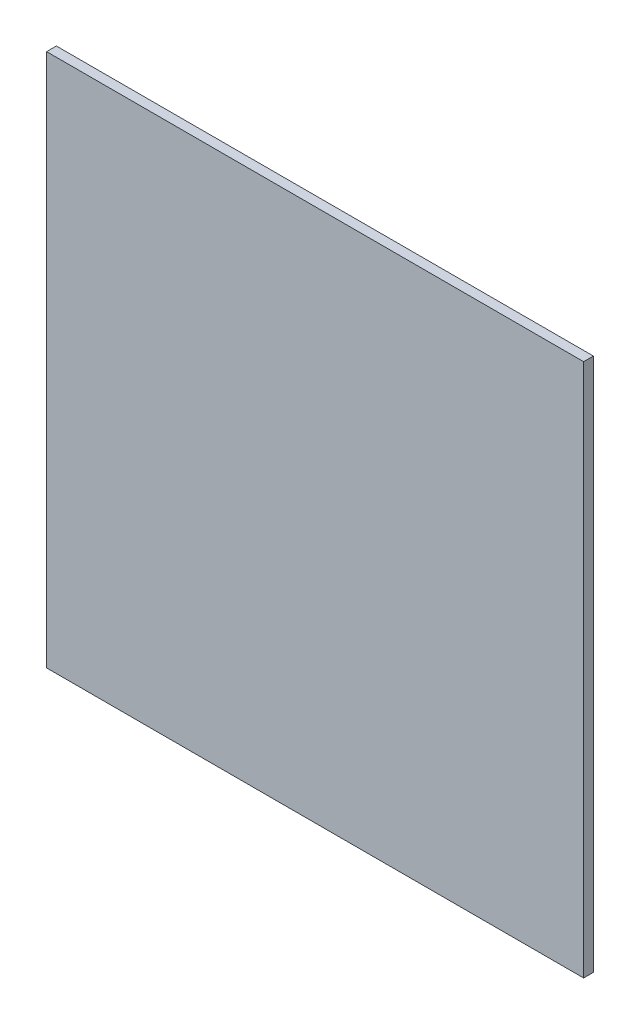
ISO-10303-21;
HEADER;
FILE_DESCRIPTION(('STEP AP214'),'2;1');
FILE_NAME('part.step','',(''),(''),'','','');
FILE_SCHEMA(('AUTOMOTIVE_DESIGN { 1 0 10303 214 1 1 1 1 }'));
ENDSEC;
DATA;
#1=APPLICATION_CONTEXT('core data for automotive mechanical design processes');
#2=APPLICATION_PROTOCOL_DEFINITION('international standard','automotive_design',2000,#1);
#3=PRODUCT_CONTEXT('',#1,'mechanical');
#4=PRODUCT('Part','Part','',(#3));
#5=PRODUCT_RELATED_PRODUCT_CATEGORY('part','',(#4));
#6=PRODUCT_DEFINITION_FORMATION('','',#4);
#7=PRODUCT_DEFINITION_CONTEXT('part definition',#1,'design');
#8=PRODUCT_DEFINITION('design','',#6,#7);
#9=PRODUCT_DEFINITION_SHAPE('','',#8);
#10=(LENGTH_UNIT() NAMED_UNIT(*) SI_UNIT(.MILLI.,.METRE.));
#11=(NAMED_UNIT(*) PLANE_ANGLE_UNIT() SI_UNIT($,.RADIAN.));
#12=(NAMED_UNIT(*) SI_UNIT($,.STERADIAN.) SOLID_ANGLE_UNIT());
#13=UNCERTAINTY_MEASURE_WITH_UNIT(LENGTH_MEASURE(1.E-05),#10,'distance_accuracy_value','');
#14=(GEOMETRIC_REPRESENTATION_CONTEXT(3) GLOBAL_UNCERTAINTY_ASSIGNED_CONTEXT((#13)) GLOBAL_UNIT_ASSIGNED_CONTEXT((#10,
#11,#12)) REPRESENTATION_CONTEXT('',''));
#15=CARTESIAN_POINT('',(0.,0.,0.));
#16=DIRECTION('',(0.,0.,1.));
#17=DIRECTION('',(1.,0.,0.));
#18=AXIS2_PLACEMENT_3D('',#15,#16,#17);
#19=CARTESIAN_POINT('',(0.,0.,6.));
#20=DIRECTION('',(-1.,0.,0.));
#21=DIRECTION('',(0.,0.,1.));
#22=AXIS2_PLACEMENT_3D('',#19,#20,#21);
#23=PLANE('',#22);
#24=DIRECTION('',(0.,1.,0.));
#25=VECTOR('',#24,1.);
#26=CARTESIAN_POINT('',(0.,0.,0.));
#27=LINE('',#26,#25);
#28=CARTESIAN_POINT('',(0.,0.,0.));
#29=VERTEX_POINT('',#28);
#30=CARTESIAN_POINT('',(0.,328.,0.));
#31=VERTEX_POINT('',#30);
#32=EDGE_CURVE('E96',#29,#31,#27,.T.);
#33=ORIENTED_EDGE('',*,*,#32,.T.);
#34=DIRECTION('',(0.,0.,-1.));
#35=VECTOR('',#34,1.);
#36=CARTESIAN_POINT('',(0.,328.,6.));
#37=LINE('',#36,#35);
#38=CARTESIAN_POINT('',(0.,328.,6.));
#39=VERTEX_POINT('',#38);
#40=EDGE_CURVE('E11',#39,#31,#37,.T.);
#41=ORIENTED_EDGE('',*,*,#40,.F.);
#42=DIRECTION('',(0.,1.,0.));
#43=VECTOR('',#42,1.);
#44=CARTESIAN_POINT('',(0.,0.,6.));
#45=LINE('',#44,#43);
#46=CARTESIAN_POINT('',(0.,0.,6.));
#47=VERTEX_POINT('',#46);
#48=EDGE_CURVE('E84',#47,#39,#45,.T.);
#49=ORIENTED_EDGE('',*,*,#48,.F.);
#50=DIRECTION('',(0.,0.,-1.));
#51=VECTOR('',#50,1.);
#52=CARTESIAN_POINT('',(0.,0.,6.));
#53=LINE('',#52,#51);
#54=EDGE_CURVE('E92',#47,#29,#53,.T.);
#55=ORIENTED_EDGE('',*,*,#54,.T.);
#56=EDGE_LOOP('',(#33,#41,#49,#55));
#57=FACE_BOUND('',#56,.T.);
#58=ADVANCED_FACE('F33',(#57),#23,.F.);
#59=CARTESIAN_POINT('',(0.,328.,6.));
#60=DIRECTION('',(0.,-1.,0.));
#61=DIRECTION('',(1.,0.,0.));
#62=AXIS2_PLACEMENT_3D('',#59,#60,#61);
#63=PLANE('',#62);
#64=DIRECTION('',(-1.,0.,0.));
#65=VECTOR('',#64,1.);
#66=CARTESIAN_POINT('',(0.,328.,0.));
#67=LINE('',#66,#65);
#68=CARTESIAN_POINT('',(-330.,328.,0.));
#69=VERTEX_POINT('',#68);
#70=EDGE_CURVE('E88',#31,#69,#67,.T.);
#71=ORIENTED_EDGE('',*,*,#70,.T.);
#72=DIRECTION('',(0.,0.,-1.));
#73=VECTOR('',#72,1.);
#74=CARTESIAN_POINT('',(-330.,328.,6.));
#75=LINE('',#74,#73);
#76=CARTESIAN_POINT('',(-330.,328.,6.));
#77=VERTEX_POINT('',#76);
#78=EDGE_CURVE('E41',#77,#69,#75,.T.);
#79=ORIENTED_EDGE('',*,*,#78,.F.);
#80=DIRECTION('',(-1.,0.,0.));
#81=VECTOR('',#80,1.);
#82=CARTESIAN_POINT('',(0.,328.,6.));
#83=LINE('',#82,#81);
#84=EDGE_CURVE('E79',#39,#77,#83,.T.);
#85=ORIENTED_EDGE('',*,*,#84,.F.);
#86=ORIENTED_EDGE('',*,*,#40,.T.);
#87=EDGE_LOOP('',(#71,#79,#85,#86));
#88=FACE_BOUND('',#87,.T.);
#89=ADVANCED_FACE('F87',(#88),#63,.F.);
#90=CARTESIAN_POINT('',(-330.,0.,6.));
#91=DIRECTION('',(1.,0.,0.));
#92=DIRECTION('',(0.,0.,-1.));
#93=AXIS2_PLACEMENT_3D('',#90,#91,#92);
#94=PLANE('',#93);
#95=DIRECTION('',(0.,-1.,0.));
#96=VECTOR('',#95,1.);
#97=CARTESIAN_POINT('',(-330.,0.,0.));
#98=LINE('',#97,#96);
#99=CARTESIAN_POINT('',(-330.,0.,0.));
#100=VERTEX_POINT('',#99);
#101=EDGE_CURVE('E66',#69,#100,#98,.T.);
#102=ORIENTED_EDGE('',*,*,#101,.T.);
#103=DIRECTION('',(0.,0.,-1.));
#104=VECTOR('',#103,1.);
#105=CARTESIAN_POINT('',(-330.,0.,6.));
#106=LINE('',#105,#104);
#107=CARTESIAN_POINT('',(-330.,0.,6.));
#108=VERTEX_POINT('',#107);
#109=EDGE_CURVE('E89',#108,#100,#106,.T.);
#110=ORIENTED_EDGE('',*,*,#109,.F.);
#111=DIRECTION('',(0.,-1.,0.));
#112=VECTOR('',#111,1.);
#113=CARTESIAN_POINT('',(-330.,0.,6.));
#114=LINE('',#113,#112);
#115=EDGE_CURVE('E82',#77,#108,#114,.T.);
#116=ORIENTED_EDGE('',*,*,#115,.F.);
#117=ORIENTED_EDGE('',*,*,#78,.T.);
#118=EDGE_LOOP('',(#102,#110,#116,#117));
#119=FACE_BOUND('',#118,.T.);
#120=ADVANCED_FACE('F90',(#119),#94,.F.);
#121=CARTESIAN_POINT('',(0.,0.,6.));
#122=DIRECTION('',(0.,1.,0.));
#123=DIRECTION('',(-1.,0.,0.));
#124=AXIS2_PLACEMENT_3D('',#121,#122,#123);
#125=PLANE('',#124);
#126=DIRECTION('',(1.,0.,0.));
#127=VECTOR('',#126,1.);
#128=CARTESIAN_POINT('',(0.,0.,0.));
#129=LINE('',#128,#127);
#130=EDGE_CURVE('E72',#100,#29,#129,.T.);
#131=ORIENTED_EDGE('',*,*,#130,.T.);
#132=ORIENTED_EDGE('',*,*,#54,.F.);
#133=DIRECTION('',(1.,0.,0.));
#134=VECTOR('',#133,1.);
#135=CARTESIAN_POINT('',(0.,0.,6.));
#136=LINE('',#135,#134);
#137=EDGE_CURVE('E49',#108,#47,#136,.T.);
#138=ORIENTED_EDGE('',*,*,#137,.F.);
#139=ORIENTED_EDGE('',*,*,#109,.T.);
#140=EDGE_LOOP('',(#131,#132,#138,#139));
#141=FACE_BOUND('',#140,.T.);
#142=ADVANCED_FACE('F103',(#141),#125,.F.);
#143=CARTESIAN_POINT('',(0.,0.,6.));
#144=DIRECTION('',(0.,0.,1.));
#145=DIRECTION('',(1.,0.,0.));
#146=AXIS2_PLACEMENT_3D('',#143,#144,#145);
#147=PLANE('',#146);
#148=ORIENTED_EDGE('',*,*,#48,.T.);
#149=ORIENTED_EDGE('',*,*,#84,.T.);
#150=ORIENTED_EDGE('',*,*,#115,.T.);
#151=ORIENTED_EDGE('',*,*,#137,.T.);
#152=EDGE_LOOP('',(#148,#149,#150,#151));
#153=FACE_BOUND('',#152,.T.);
#154=ADVANCED_FACE('F80',(#153),#147,.T.);
#155=CARTESIAN_POINT('',(0.,0.,0.));
#156=DIRECTION('',(0.,0.,1.));
#157=DIRECTION('',(1.,0.,0.));
#158=AXIS2_PLACEMENT_3D('',#155,#156,#157);
#159=PLANE('',#158);
#160=ORIENTED_EDGE('',*,*,#32,.F.);
#161=ORIENTED_EDGE('',*,*,#130,.F.);
#162=ORIENTED_EDGE('',*,*,#101,.F.);
#163=ORIENTED_EDGE('',*,*,#70,.F.);
#164=EDGE_LOOP('',(#160,#161,#162,#163));
#165=FACE_BOUND('',#164,.T.);
#166=ADVANCED_FACE('F106',(#165),#159,.F.);
#167=CLOSED_SHELL('',(#58,#89,#120,#142,#154,#166));
#168=MANIFOLD_SOLID_BREP('B2',#167);
#169=ADVANCED_BREP_SHAPE_REPRESENTATION('',(#18,#168),#14);
#170=SHAPE_DEFINITION_REPRESENTATION(#9,#169);
ENDSEC;
END-ISO-10303-21;
